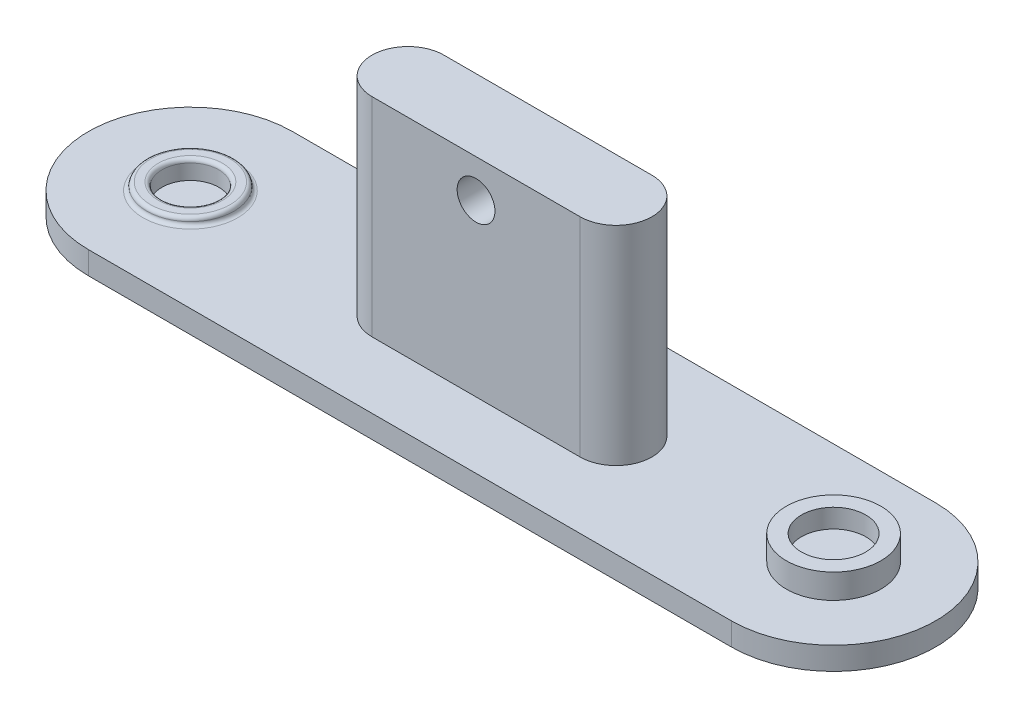
ISO-10303-21;
HEADER;
FILE_DESCRIPTION(('STEP AP214'),'2;1');
FILE_NAME('part.step','',(''),(''),'','','');
FILE_SCHEMA(('AUTOMOTIVE_DESIGN { 1 0 10303 214 1 1 1 1 }'));
ENDSEC;
DATA;
#1=APPLICATION_CONTEXT('core data for automotive mechanical design processes');
#2=APPLICATION_PROTOCOL_DEFINITION('international standard','automotive_design',2000,#1);
#3=PRODUCT_CONTEXT('',#1,'mechanical');
#4=PRODUCT('Part','Part','',(#3));
#5=PRODUCT_RELATED_PRODUCT_CATEGORY('part','',(#4));
#6=PRODUCT_DEFINITION_FORMATION('','',#4);
#7=PRODUCT_DEFINITION_CONTEXT('part definition',#1,'design');
#8=PRODUCT_DEFINITION('design','',#6,#7);
#9=PRODUCT_DEFINITION_SHAPE('','',#8);
#10=(LENGTH_UNIT() NAMED_UNIT(*) SI_UNIT(.MILLI.,.METRE.));
#11=(NAMED_UNIT(*) PLANE_ANGLE_UNIT() SI_UNIT($,.RADIAN.));
#12=(NAMED_UNIT(*) SI_UNIT($,.STERADIAN.) SOLID_ANGLE_UNIT());
#13=UNCERTAINTY_MEASURE_WITH_UNIT(LENGTH_MEASURE(1.E-05),#10,'distance_accuracy_value','');
#14=(GEOMETRIC_REPRESENTATION_CONTEXT(3) GLOBAL_UNCERTAINTY_ASSIGNED_CONTEXT((#13)) GLOBAL_UNIT_ASSIGNED_CONTEXT((#10,
#11,#12)) REPRESENTATION_CONTEXT('',''));
#15=CARTESIAN_POINT('',(0.,0.,0.));
#16=DIRECTION('',(0.,0.,1.));
#17=DIRECTION('',(1.,0.,0.));
#18=AXIS2_PLACEMENT_3D('',#15,#16,#17);
#19=CARTESIAN_POINT('',(-42.5000000000004,3.,0.));
#20=DIRECTION('',(0.,1.,0.));
#21=DIRECTION('',(0.,0.,1.));
#22=AXIS2_PLACEMENT_3D('',#19,#20,#21);
#23=PLANE('',#22);
#24=CARTESIAN_POINT('',(-42.5000000000004,3.,0.));
#25=DIRECTION('',(0.,1.,0.));
#26=DIRECTION('',(0.,0.,1.));
#27=AXIS2_PLACEMENT_3D('',#24,#25,#26);
#28=CIRCLE('',#27,6.25);
#29=CARTESIAN_POINT('',(-42.5000000000004,3.,6.25));
#30=VERTEX_POINT('',#29);
#31=EDGE_CURVE('E11',#30,#30,#28,.F.);
#32=ORIENTED_EDGE('',*,*,#31,.T.);
#33=EDGE_LOOP('',(#32));
#34=FACE_BOUND('',#33,.T.);
#35=CARTESIAN_POINT('',(42.5000000000004,3.,0.));
#36=DIRECTION('',(0.,1.,0.));
#37=DIRECTION('',(0.,0.,1.));
#38=AXIS2_PLACEMENT_3D('',#35,#36,#37);
#39=CIRCLE('',#38,6.25);
#40=CARTESIAN_POINT('',(42.5000000000004,3.,-6.25000000000001));
#41=VERTEX_POINT('',#40);
#42=EDGE_CURVE('E168',#41,#41,#39,.T.);
#43=ORIENTED_EDGE('',*,*,#42,.F.);
#44=EDGE_LOOP('',(#43));
#45=FACE_BOUND('',#44,.T.);
#46=CARTESIAN_POINT('',(-42.5000000000004,3.,0.));
#47=DIRECTION('',(0.,1.,0.));
#48=DIRECTION('',(0.,0.,1.));
#49=AXIS2_PLACEMENT_3D('',#46,#47,#48);
#50=CIRCLE('',#49,13.5);
#51=CARTESIAN_POINT('',(-42.5000000000004,3.,-13.5));
#52=VERTEX_POINT('',#51);
#53=CARTESIAN_POINT('',(-42.5000000000004,3.,13.5));
#54=VERTEX_POINT('',#53);
#55=EDGE_CURVE('E182',#52,#54,#50,.T.);
#56=ORIENTED_EDGE('',*,*,#55,.T.);
#57=DIRECTION('',(1.,0.,0.));
#58=VECTOR('',#57,1.);
#59=CARTESIAN_POINT('',(-42.5000000000004,3.,13.5));
#60=LINE('',#59,#58);
#61=CARTESIAN_POINT('',(42.5000000000005,3.,13.5));
#62=VERTEX_POINT('',#61);
#63=EDGE_CURVE('E104',#54,#62,#60,.T.);
#64=ORIENTED_EDGE('',*,*,#63,.T.);
#65=CARTESIAN_POINT('',(42.5000000000004,3.,0.));
#66=DIRECTION('',(0.,1.,0.));
#67=DIRECTION('',(0.,0.,-1.));
#68=AXIS2_PLACEMENT_3D('',#65,#66,#67);
#69=CIRCLE('',#68,13.5);
#70=CARTESIAN_POINT('',(42.5000000000004,3.,-13.5));
#71=VERTEX_POINT('',#70);
#72=EDGE_CURVE('E187',#62,#71,#69,.T.);
#73=ORIENTED_EDGE('',*,*,#72,.T.);
#74=DIRECTION('',(-1.,0.,0.));
#75=VECTOR('',#74,1.);
#76=CARTESIAN_POINT('',(-42.5000000000004,3.,-13.5));
#77=LINE('',#76,#75);
#78=EDGE_CURVE('E69',#71,#52,#77,.T.);
#79=ORIENTED_EDGE('',*,*,#78,.T.);
#80=EDGE_LOOP('',(#56,#64,#73,#79));
#81=FACE_BOUND('',#80,.T.);
#82=DIRECTION('',(1.,0.,0.));
#83=VECTOR('',#82,1.);
#84=CARTESIAN_POINT('',(-13.75,3.,4.75));
#85=LINE('',#84,#83);
#86=CARTESIAN_POINT('',(-13.75,3.,4.75));
#87=VERTEX_POINT('',#86);
#88=CARTESIAN_POINT('',(13.75,3.,4.75));
#89=VERTEX_POINT('',#88);
#90=EDGE_CURVE('E474',#87,#89,#85,.T.);
#91=ORIENTED_EDGE('',*,*,#90,.F.);
#92=CARTESIAN_POINT('',(-13.75,3.,0.));
#93=DIRECTION('',(0.,1.,0.));
#94=DIRECTION('',(0.,0.,1.));
#95=AXIS2_PLACEMENT_3D('',#92,#93,#94);
#96=CIRCLE('',#95,4.75);
#97=CARTESIAN_POINT('',(-13.75,3.,-4.75));
#98=VERTEX_POINT('',#97);
#99=EDGE_CURVE('E151',#98,#87,#96,.T.);
#100=ORIENTED_EDGE('',*,*,#99,.F.);
#101=DIRECTION('',(-1.,0.,0.));
#102=VECTOR('',#101,1.);
#103=CARTESIAN_POINT('',(-13.75,3.,-4.75));
#104=LINE('',#103,#102);
#105=CARTESIAN_POINT('',(13.75,3.,-4.75));
#106=VERTEX_POINT('',#105);
#107=EDGE_CURVE('E147',#106,#98,#104,.T.);
#108=ORIENTED_EDGE('',*,*,#107,.F.);
#109=CARTESIAN_POINT('',(13.75,3.,0.));
#110=DIRECTION('',(0.,1.,0.));
#111=DIRECTION('',(0.,0.,-1.));
#112=AXIS2_PLACEMENT_3D('',#109,#110,#111);
#113=CIRCLE('',#112,4.75);
#114=EDGE_CURVE('E483',#89,#106,#113,.T.);
#115=ORIENTED_EDGE('',*,*,#114,.F.);
#116=EDGE_LOOP('',(#91,#100,#108,#115));
#117=FACE_BOUND('',#116,.T.);
#118=ADVANCED_FACE('F39',(#34,#45,#81,#117),#23,.T.);
#119=CARTESIAN_POINT('',(-42.5000000000004,3.,0.));
#120=DIRECTION('',(0.,-1.,0.));
#121=DIRECTION('',(0.,0.,-1.));
#122=AXIS2_PLACEMENT_3D('',#119,#120,#121);
#123=CYLINDRICAL_SURFACE('',#122,13.5);
#124=CARTESIAN_POINT('',(-42.5000000000004,0.,0.));
#125=DIRECTION('',(0.,1.,0.));
#126=DIRECTION('',(0.,0.,1.));
#127=AXIS2_PLACEMENT_3D('',#124,#125,#126);
#128=CIRCLE('',#127,13.5);
#129=CARTESIAN_POINT('',(-42.5000000000004,0.,-13.5));
#130=VERTEX_POINT('',#129);
#131=CARTESIAN_POINT('',(-42.5000000000004,0.,13.5));
#132=VERTEX_POINT('',#131);
#133=EDGE_CURVE('E181',#130,#132,#128,.T.);
#134=ORIENTED_EDGE('',*,*,#133,.T.);
#135=DIRECTION('',(0.,-1.,0.));
#136=VECTOR('',#135,1.);
#137=CARTESIAN_POINT('',(-42.5000000000004,3.,13.5));
#138=LINE('',#137,#136);
#139=EDGE_CURVE('E212',#54,#132,#138,.T.);
#140=ORIENTED_EDGE('',*,*,#139,.F.);
#141=ORIENTED_EDGE('',*,*,#55,.F.);
#142=DIRECTION('',(0.,-1.,0.));
#143=VECTOR('',#142,1.);
#144=CARTESIAN_POINT('',(-42.5000000000004,3.,-13.5));
#145=LINE('',#144,#143);
#146=EDGE_CURVE('E192',#52,#130,#145,.T.);
#147=ORIENTED_EDGE('',*,*,#146,.T.);
#148=EDGE_LOOP('',(#134,#140,#141,#147));
#149=FACE_BOUND('',#148,.T.);
#150=ADVANCED_FACE('F254',(#149),#123,.T.);
#151=CARTESIAN_POINT('',(-42.5000000000004,3.,13.5));
#152=DIRECTION('',(0.,0.,-1.));
#153=DIRECTION('',(-1.,0.,0.));
#154=AXIS2_PLACEMENT_3D('',#151,#152,#153);
#155=PLANE('',#154);
#156=DIRECTION('',(1.,0.,0.));
#157=VECTOR('',#156,1.);
#158=CARTESIAN_POINT('',(-42.5000000000004,0.,13.5));
#159=LINE('',#158,#157);
#160=CARTESIAN_POINT('',(42.5000000000005,0.,13.5));
#161=VERTEX_POINT('',#160);
#162=EDGE_CURVE('E196',#132,#161,#159,.T.);
#163=ORIENTED_EDGE('',*,*,#162,.T.);
#164=DIRECTION('',(0.,-1.,0.));
#165=VECTOR('',#164,1.);
#166=CARTESIAN_POINT('',(42.5000000000005,3.,13.5));
#167=LINE('',#166,#165);
#168=EDGE_CURVE('E209',#62,#161,#167,.T.);
#169=ORIENTED_EDGE('',*,*,#168,.F.);
#170=ORIENTED_EDGE('',*,*,#63,.F.);
#171=ORIENTED_EDGE('',*,*,#139,.T.);
#172=EDGE_LOOP('',(#163,#169,#170,#171));
#173=FACE_BOUND('',#172,.T.);
#174=ADVANCED_FACE('F260',(#173),#155,.F.);
#175=CARTESIAN_POINT('',(42.5000000000004,3.,0.));
#176=DIRECTION('',(0.,-1.,0.));
#177=DIRECTION('',(0.,0.,-1.));
#178=AXIS2_PLACEMENT_3D('',#175,#176,#177);
#179=CYLINDRICAL_SURFACE('',#178,13.5);
#180=CARTESIAN_POINT('',(42.5000000000004,0.,0.));
#181=DIRECTION('',(0.,1.,0.));
#182=DIRECTION('',(0.,0.,-1.));
#183=AXIS2_PLACEMENT_3D('',#180,#181,#182);
#184=CIRCLE('',#183,13.5);
#185=CARTESIAN_POINT('',(42.5000000000004,0.,-13.5));
#186=VERTEX_POINT('',#185);
#187=EDGE_CURVE('E199',#161,#186,#184,.T.);
#188=ORIENTED_EDGE('',*,*,#187,.T.);
#189=DIRECTION('',(0.,-1.,0.));
#190=VECTOR('',#189,1.);
#191=CARTESIAN_POINT('',(42.5000000000004,3.,-13.5));
#192=LINE('',#191,#190);
#193=EDGE_CURVE('E206',#71,#186,#192,.T.);
#194=ORIENTED_EDGE('',*,*,#193,.F.);
#195=ORIENTED_EDGE('',*,*,#72,.F.);
#196=ORIENTED_EDGE('',*,*,#168,.T.);
#197=EDGE_LOOP('',(#188,#194,#195,#196));
#198=FACE_BOUND('',#197,.T.);
#199=ADVANCED_FACE('F273',(#198),#179,.T.);
#200=CARTESIAN_POINT('',(-42.5000000000004,3.,-13.5));
#201=DIRECTION('',(0.,0.,1.));
#202=DIRECTION('',(1.,0.,0.));
#203=AXIS2_PLACEMENT_3D('',#200,#201,#202);
#204=PLANE('',#203);
#205=DIRECTION('',(-1.,0.,0.));
#206=VECTOR('',#205,1.);
#207=CARTESIAN_POINT('',(-42.5000000000004,0.,-13.5));
#208=LINE('',#207,#206);
#209=EDGE_CURVE('E96',#186,#130,#208,.T.);
#210=ORIENTED_EDGE('',*,*,#209,.T.);
#211=ORIENTED_EDGE('',*,*,#146,.F.);
#212=ORIENTED_EDGE('',*,*,#78,.F.);
#213=ORIENTED_EDGE('',*,*,#193,.T.);
#214=EDGE_LOOP('',(#210,#211,#212,#213));
#215=FACE_BOUND('',#214,.T.);
#216=ADVANCED_FACE('F269',(#215),#204,.F.);
#217=CARTESIAN_POINT('',(-42.5000000000004,0.,0.));
#218=DIRECTION('',(0.,1.,0.));
#219=DIRECTION('',(0.,0.,1.));
#220=AXIS2_PLACEMENT_3D('',#217,#218,#219);
#221=PLANE('',#220);
#222=ORIENTED_EDGE('',*,*,#133,.F.);
#223=ORIENTED_EDGE('',*,*,#209,.F.);
#224=ORIENTED_EDGE('',*,*,#187,.F.);
#225=ORIENTED_EDGE('',*,*,#162,.F.);
#226=EDGE_LOOP('',(#222,#223,#224,#225));
#227=FACE_BOUND('',#226,.T.);
#228=ADVANCED_FACE('F266',(#227),#221,.F.);
#229=CARTESIAN_POINT('',(-42.5000000000004,4.,0.));
#230=DIRECTION('',(0.,1.,0.));
#231=DIRECTION('',(0.,0.,1.));
#232=AXIS2_PLACEMENT_3D('',#229,#230,#231);
#233=PLANE('',#232);
#234=CARTESIAN_POINT('',(-42.5000000000004,4.,0.));
#235=DIRECTION('',(0.,1.,0.));
#236=DIRECTION('',(0.,0.,1.));
#237=AXIS2_PLACEMENT_3D('',#234,#235,#236);
#238=CIRCLE('',#237,4.25000000000001);
#239=CARTESIAN_POINT('',(-42.5000000000004,4.,4.25000000000001));
#240=VERTEX_POINT('',#239);
#241=EDGE_CURVE('E49',#240,#240,#238,.F.);
#242=ORIENTED_EDGE('',*,*,#241,.T.);
#243=EDGE_LOOP('',(#242));
#244=FACE_BOUND('',#243,.T.);
#245=CARTESIAN_POINT('',(-42.5000000000004,4.,0.));
#246=DIRECTION('',(0.,1.,0.));
#247=DIRECTION('',(0.,0.,1.));
#248=AXIS2_PLACEMENT_3D('',#245,#246,#247);
#249=CIRCLE('',#248,5.25);
#250=CARTESIAN_POINT('',(-42.5000000000004,4.,5.25));
#251=VERTEX_POINT('',#250);
#252=EDGE_CURVE('E219',#251,#251,#249,.T.);
#253=ORIENTED_EDGE('',*,*,#252,.T.);
#254=EDGE_LOOP('',(#253));
#255=FACE_BOUND('',#254,.T.);
#256=ADVANCED_FACE('F227',(#244,#255),#233,.T.);
#257=CARTESIAN_POINT('',(-42.5000000000004,1.5,0.));
#258=DIRECTION('',(0.,1.,0.));
#259=DIRECTION('',(0.,0.,1.));
#260=AXIS2_PLACEMENT_3D('',#257,#258,#259);
#261=CYLINDRICAL_SURFACE('',#260,3.75000000000001);
#262=CARTESIAN_POINT('',(-42.5000000000004,3.5,0.));
#263=DIRECTION('',(0.,1.,0.));
#264=DIRECTION('',(0.,0.,1.));
#265=AXIS2_PLACEMENT_3D('',#262,#263,#264);
#266=CIRCLE('',#265,3.75000000000001);
#267=CARTESIAN_POINT('',(-42.5000000000004,3.5,3.75000000000001));
#268=VERTEX_POINT('',#267);
#269=EDGE_CURVE('E215',#268,#268,#266,.T.);
#270=ORIENTED_EDGE('',*,*,#269,.T.);
#271=EDGE_LOOP('',(#270));
#272=FACE_BOUND('',#271,.T.);
#273=CARTESIAN_POINT('',(-42.5000000000004,1.5,0.));
#274=DIRECTION('',(0.,1.,0.));
#275=DIRECTION('',(0.,0.,1.));
#276=AXIS2_PLACEMENT_3D('',#273,#274,#275);
#277=CIRCLE('',#276,3.75000000000001);
#278=CARTESIAN_POINT('',(-42.5000000000004,1.5,3.75000000000001));
#279=VERTEX_POINT('',#278);
#280=EDGE_CURVE('E174',#279,#279,#277,.T.);
#281=ORIENTED_EDGE('',*,*,#280,.F.);
#282=EDGE_LOOP('',(#281));
#283=FACE_BOUND('',#282,.T.);
#284=ADVANCED_FACE('F237',(#272,#283),#261,.F.);
#285=CARTESIAN_POINT('',(-42.5000000000004,1.5,0.));
#286=DIRECTION('',(0.,1.,0.));
#287=DIRECTION('',(0.,0.,1.));
#288=AXIS2_PLACEMENT_3D('',#285,#286,#287);
#289=PLANE('',#288);
#290=ORIENTED_EDGE('',*,*,#280,.T.);
#291=EDGE_LOOP('',(#290));
#292=FACE_BOUND('',#291,.T.);
#293=ADVANCED_FACE('F240',(#292),#289,.T.);
#294=CARTESIAN_POINT('',(42.5000000000004,6.25,0.));
#295=DIRECTION('',(0.,-1.,0.));
#296=DIRECTION('',(0.,0.,-1.));
#297=AXIS2_PLACEMENT_3D('',#294,#295,#296);
#298=CYLINDRICAL_SURFACE('',#297,6.25);
#299=CARTESIAN_POINT('',(42.5000000000004,6.25,0.));
#300=DIRECTION('',(0.,1.,0.));
#301=DIRECTION('',(0.,0.,1.));
#302=AXIS2_PLACEMENT_3D('',#299,#300,#301);
#303=CIRCLE('',#302,6.25);
#304=CARTESIAN_POINT('',(42.5000000000004,6.25,-6.25000000000001));
#305=VERTEX_POINT('',#304);
#306=EDGE_CURVE('E170',#305,#305,#303,.T.);
#307=CARTESIAN_POINT('',(42.5000000000004,6.25,-6.25000000000001));
#308=CARTESIAN_POINT('',(42.5000000000004,6.21614583333333,-6.25000000000001));
#309=CARTESIAN_POINT('',(42.5000000000004,6.18229166666667,-6.25000000000001));
#310=CARTESIAN_POINT('',(42.5000000000004,6.11458333333333,-6.25000000000001));
#311=CARTESIAN_POINT('',(42.5000000000004,6.08072916666667,-6.25000000000001));
#312=CARTESIAN_POINT('',(42.5000000000004,6.01302083333333,-6.25000000000001));
#313=CARTESIAN_POINT('',(42.5000000000004,5.97916666666667,-6.25000000000001));
#314=CARTESIAN_POINT('',(42.5000000000004,5.91145833333333,-6.25000000000001));
#315=CARTESIAN_POINT('',(42.5000000000004,5.87760416666667,-6.25000000000001));
#316=CARTESIAN_POINT('',(42.5000000000004,5.80989583333333,-6.25000000000001));
#317=CARTESIAN_POINT('',(42.5000000000004,5.77604166666667,-6.25000000000001));
#318=CARTESIAN_POINT('',(42.5000000000004,5.70833333333333,-6.25000000000001));
#319=CARTESIAN_POINT('',(42.5000000000004,5.67447916666667,-6.25000000000001));
#320=CARTESIAN_POINT('',(42.5000000000004,5.60677083333333,-6.25000000000001));
#321=CARTESIAN_POINT('',(42.5000000000004,5.57291666666667,-6.25000000000001));
#322=CARTESIAN_POINT('',(42.5000000000004,5.50520833333333,-6.25000000000001));
#323=CARTESIAN_POINT('',(42.5000000000004,5.47135416666667,-6.25000000000001));
#324=CARTESIAN_POINT('',(42.5000000000004,5.40364583333333,-6.25000000000001));
#325=CARTESIAN_POINT('',(42.5000000000004,5.36979166666667,-6.25000000000001));
#326=CARTESIAN_POINT('',(42.5000000000004,5.30208333333333,-6.25000000000001));
#327=CARTESIAN_POINT('',(42.5000000000004,5.26822916666667,-6.25000000000001));
#328=CARTESIAN_POINT('',(42.5000000000004,5.20052083333333,-6.25000000000001));
#329=CARTESIAN_POINT('',(42.5000000000004,5.16666666666667,-6.25000000000001));
#330=CARTESIAN_POINT('',(42.5000000000004,5.09895833333333,-6.25000000000001));
#331=CARTESIAN_POINT('',(42.5000000000004,5.06510416666667,-6.25000000000001));
#332=CARTESIAN_POINT('',(42.5000000000004,4.99739583333333,-6.25000000000001));
#333=CARTESIAN_POINT('',(42.5000000000004,4.96354166666667,-6.25000000000001));
#334=CARTESIAN_POINT('',(42.5000000000004,4.89583333333333,-6.25000000000001));
#335=CARTESIAN_POINT('',(42.5000000000004,4.86197916666667,-6.25000000000001));
#336=CARTESIAN_POINT('',(42.5000000000004,4.79427083333333,-6.25000000000001));
#337=CARTESIAN_POINT('',(42.5000000000004,4.76041666666667,-6.25000000000001));
#338=CARTESIAN_POINT('',(42.5000000000004,4.69270833333333,-6.25000000000001));
#339=CARTESIAN_POINT('',(42.5000000000004,4.65885416666667,-6.25000000000001));
#340=CARTESIAN_POINT('',(42.5000000000004,4.59114583333333,-6.25000000000001));
#341=CARTESIAN_POINT('',(42.5000000000004,4.55729166666667,-6.25000000000001));
#342=CARTESIAN_POINT('',(42.5000000000004,4.48958333333333,-6.25000000000001));
#343=CARTESIAN_POINT('',(42.5000000000004,4.45572916666667,-6.25000000000001));
#344=CARTESIAN_POINT('',(42.5000000000004,4.38802083333333,-6.25000000000001));
#345=CARTESIAN_POINT('',(42.5000000000004,4.35416666666667,-6.25000000000001));
#346=CARTESIAN_POINT('',(42.5000000000004,4.28645833333333,-6.25000000000001));
#347=CARTESIAN_POINT('',(42.5000000000004,4.25260416666667,-6.25000000000001));
#348=CARTESIAN_POINT('',(42.5000000000004,4.18489583333333,-6.25000000000001));
#349=CARTESIAN_POINT('',(42.5000000000004,4.15104166666667,-6.25000000000001));
#350=CARTESIAN_POINT('',(42.5000000000004,4.08333333333333,-6.25000000000001));
#351=CARTESIAN_POINT('',(42.5000000000004,4.04947916666667,-6.25000000000001));
#352=CARTESIAN_POINT('',(42.5000000000004,3.98177083333333,-6.25000000000001));
#353=CARTESIAN_POINT('',(42.5000000000004,3.94791666666667,-6.25000000000001));
#354=CARTESIAN_POINT('',(42.5000000000004,3.88020833333333,-6.25000000000001));
#355=CARTESIAN_POINT('',(42.5000000000004,3.84635416666667,-6.25000000000001));
#356=CARTESIAN_POINT('',(42.5000000000004,3.77864583333333,-6.25000000000001));
#357=CARTESIAN_POINT('',(42.5000000000004,3.74479166666667,-6.25000000000001));
#358=CARTESIAN_POINT('',(42.5000000000004,3.67708333333333,-6.25000000000001));
#359=CARTESIAN_POINT('',(42.5000000000004,3.64322916666667,-6.25000000000001));
#360=CARTESIAN_POINT('',(42.5000000000004,3.57552083333333,-6.25000000000001));
#361=CARTESIAN_POINT('',(42.5000000000004,3.54166666666667,-6.25000000000001));
#362=CARTESIAN_POINT('',(42.5000000000004,3.47395833333333,-6.25000000000001));
#363=CARTESIAN_POINT('',(42.5000000000004,3.44010416666667,-6.25000000000001));
#364=CARTESIAN_POINT('',(42.5000000000004,3.37239583333333,-6.25000000000001));
#365=CARTESIAN_POINT('',(42.5000000000004,3.33854166666667,-6.25000000000001));
#366=CARTESIAN_POINT('',(42.5000000000004,3.27083333333333,-6.25000000000001));
#367=CARTESIAN_POINT('',(42.5000000000004,3.23697916666667,-6.25000000000001));
#368=CARTESIAN_POINT('',(42.5000000000004,3.16927083333333,-6.25000000000001));
#369=CARTESIAN_POINT('',(42.5000000000004,3.13541666666667,-6.25000000000001));
#370=CARTESIAN_POINT('',(42.5000000000004,3.06770833333333,-6.25000000000001));
#371=CARTESIAN_POINT('',(42.5000000000004,3.03385416666667,-6.25000000000001));
#372=CARTESIAN_POINT('',(42.5000000000004,3.,-6.25000000000001));
#373=B_SPLINE_CURVE_WITH_KNOTS('',3,(#307,#308,#309,#310,#311,#312,#313,#314,#315,#316,#317,
#318,#319,#320,#321,#322,#323,#324,#325,#326,#327,#328,#329,#330,#331,#332,#333,#334,#335,#336,
#337,#338,#339,#340,#341,#342,#343,#344,#345,#346,#347,#348,#349,#350,#351,#352,#353,#354,#355,
#356,#357,#358,#359,#360,#361,#362,#363,#364,#365,#366,#367,#368,#369,#370,#371,#372),
.UNSPECIFIED.,.F.,.F.,(4,2,2,2,2,2,2,2,2,2,2,2,2,2,2,2,2,2,2,2,2,2,2,2,2,2,2,2,2,2,2,2,4),(0.,
0.101562499999999,0.203124999999999,0.304687499999999,0.40625,0.5078125,0.609375,0.7109375,
0.8125,0.9140625,1.015625,1.1171875,1.21875,1.3203125,1.421875,1.5234375,1.625,1.7265625,
1.828125,1.9296875,2.03125,2.1328125,2.234375,2.3359375,2.4375,2.5390625,2.640625,2.7421875,
2.84375,2.9453125,3.046875,3.1484375,3.25),.UNSPECIFIED.);
#374=EDGE_CURVE('BSEAM245',#305,#41,#373,.T.);
#375=ORIENTED_EDGE('',*,*,#306,.F.);
#376=ORIENTED_EDGE('',*,*,#42,.T.);
#377=ORIENTED_EDGE('',*,*,#374,.T.);
#378=ORIENTED_EDGE('',*,*,#374,.F.);
#379=EDGE_LOOP('',(#375,#377,#376,#378));
#380=FACE_BOUND('',#379,.T.);
#381=ADVANCED_FACE('F245',(#380),#298,.T.);
#382=CARTESIAN_POINT('',(42.5000000000004,6.25,0.));
#383=DIRECTION('',(0.,1.,0.));
#384=DIRECTION('',(0.,0.,1.));
#385=AXIS2_PLACEMENT_3D('',#382,#383,#384);
#386=PLANE('',#385);
#387=CARTESIAN_POINT('',(42.5000000000004,6.25,0.));
#388=DIRECTION('',(0.,1.,0.));
#389=DIRECTION('',(0.,0.,1.));
#390=AXIS2_PLACEMENT_3D('',#387,#388,#389);
#391=CIRCLE('',#390,4.25000000000001);
#392=CARTESIAN_POINT('',(42.5000000000004,6.25,4.24999999999999));
#393=VERTEX_POINT('',#392);
#394=EDGE_CURVE('E154',#393,#393,#391,.T.);
#395=ORIENTED_EDGE('',*,*,#394,.F.);
#396=EDGE_LOOP('',(#395));
#397=FACE_BOUND('',#396,.T.);
#398=ORIENTED_EDGE('',*,*,#306,.T.);
#399=EDGE_LOOP('',(#398));
#400=FACE_BOUND('',#399,.T.);
#401=ADVANCED_FACE('F250',(#397,#400),#386,.T.);
#402=CARTESIAN_POINT('',(42.5000000000004,3.75,0.));
#403=DIRECTION('',(0.,1.,0.));
#404=DIRECTION('',(0.,0.,1.));
#405=AXIS2_PLACEMENT_3D('',#402,#403,#404);
#406=CYLINDRICAL_SURFACE('',#405,4.25000000000001);
#407=CARTESIAN_POINT('',(42.5000000000004,3.75,0.));
#408=DIRECTION('',(0.,1.,0.));
#409=DIRECTION('',(0.,0.,1.));
#410=AXIS2_PLACEMENT_3D('',#407,#408,#409);
#411=CIRCLE('',#410,4.25000000000001);
#412=CARTESIAN_POINT('',(42.5000000000004,3.75,4.24999999999999));
#413=VERTEX_POINT('',#412);
#414=EDGE_CURVE('E160',#413,#413,#411,.T.);
#415=ORIENTED_EDGE('',*,*,#414,.F.);
#416=EDGE_LOOP('',(#415));
#417=FACE_BOUND('',#416,.T.);
#418=ORIENTED_EDGE('',*,*,#394,.T.);
#419=EDGE_LOOP('',(#418));
#420=FACE_BOUND('',#419,.T.);
#421=ADVANCED_FACE('F354',(#417,#420),#406,.F.);
#422=CARTESIAN_POINT('',(42.5000000000004,3.75,0.));
#423=DIRECTION('',(0.,1.,0.));
#424=DIRECTION('',(0.,0.,1.));
#425=AXIS2_PLACEMENT_3D('',#422,#423,#424);
#426=PLANE('',#425);
#427=ORIENTED_EDGE('',*,*,#414,.T.);
#428=EDGE_LOOP('',(#427));
#429=FACE_BOUND('',#428,.T.);
#430=ADVANCED_FACE('F358',(#429),#426,.T.);
#431=CARTESIAN_POINT('',(-13.75,30.5,0.));
#432=DIRECTION('',(0.,-1.,0.));
#433=DIRECTION('',(0.,0.,-1.));
#434=AXIS2_PLACEMENT_3D('',#431,#432,#433);
#435=CYLINDRICAL_SURFACE('',#434,4.75);
#436=ORIENTED_EDGE('',*,*,#99,.T.);
#437=DIRECTION('',(0.,-1.,0.));
#438=VECTOR('',#437,1.);
#439=CARTESIAN_POINT('',(-13.75,30.5,4.75));
#440=LINE('',#439,#438);
#441=CARTESIAN_POINT('',(-13.75,30.5,4.75));
#442=VERTEX_POINT('',#441);
#443=EDGE_CURVE('E132',#442,#87,#440,.T.);
#444=ORIENTED_EDGE('',*,*,#443,.F.);
#445=CARTESIAN_POINT('',(-13.75,30.5,0.));
#446=DIRECTION('',(0.,1.,0.));
#447=DIRECTION('',(0.,0.,1.));
#448=AXIS2_PLACEMENT_3D('',#445,#446,#447);
#449=CIRCLE('',#448,4.75);
#450=CARTESIAN_POINT('',(-13.75,30.5,-4.75));
#451=VERTEX_POINT('',#450);
#452=EDGE_CURVE('E139',#451,#442,#449,.T.);
#453=ORIENTED_EDGE('',*,*,#452,.F.);
#454=DIRECTION('',(0.,-1.,0.));
#455=VECTOR('',#454,1.);
#456=CARTESIAN_POINT('',(-13.75,30.5,-4.75));
#457=LINE('',#456,#455);
#458=EDGE_CURVE('E479',#451,#98,#457,.T.);
#459=ORIENTED_EDGE('',*,*,#458,.T.);
#460=EDGE_LOOP('',(#436,#444,#453,#459));
#461=FACE_BOUND('',#460,.T.);
#462=ADVANCED_FACE('F149',(#461),#435,.T.);
#463=CARTESIAN_POINT('',(-13.75,30.5,4.75));
#464=DIRECTION('',(0.,0.,-1.));
#465=DIRECTION('',(-1.,0.,0.));
#466=AXIS2_PLACEMENT_3D('',#463,#464,#465);
#467=PLANE('',#466);
#468=CARTESIAN_POINT('',(0.,25.5,4.75));
#469=DIRECTION('',(0.,0.,-1.));
#470=DIRECTION('',(-1.,0.,0.));
#471=AXIS2_PLACEMENT_3D('',#468,#469,#470);
#472=CIRCLE('',#471,2.5);
#473=CARTESIAN_POINT('',(-2.5,25.5,4.75));
#474=VERTEX_POINT('',#473);
#475=EDGE_CURVE('E471',#474,#474,#472,.T.);
#476=ORIENTED_EDGE('',*,*,#475,.T.);
#477=EDGE_LOOP('',(#476));
#478=FACE_BOUND('',#477,.T.);
#479=ORIENTED_EDGE('',*,*,#90,.T.);
#480=DIRECTION('',(0.,-1.,0.));
#481=VECTOR('',#480,1.);
#482=CARTESIAN_POINT('',(13.75,30.5,4.75));
#483=LINE('',#482,#481);
#484=CARTESIAN_POINT('',(13.75,30.5,4.75));
#485=VERTEX_POINT('',#484);
#486=EDGE_CURVE('E135',#485,#89,#483,.T.);
#487=ORIENTED_EDGE('',*,*,#486,.F.);
#488=DIRECTION('',(1.,0.,0.));
#489=VECTOR('',#488,1.);
#490=CARTESIAN_POINT('',(-13.75,30.5,4.75));
#491=LINE('',#490,#489);
#492=EDGE_CURVE('E128',#442,#485,#491,.T.);
#493=ORIENTED_EDGE('',*,*,#492,.F.);
#494=ORIENTED_EDGE('',*,*,#443,.T.);
#495=EDGE_LOOP('',(#479,#487,#493,#494));
#496=FACE_BOUND('',#495,.T.);
#497=ADVANCED_FACE('F130',(#478,#496),#467,.F.);
#498=CARTESIAN_POINT('',(13.75,30.5,0.));
#499=DIRECTION('',(0.,-1.,0.));
#500=DIRECTION('',(0.,0.,-1.));
#501=AXIS2_PLACEMENT_3D('',#498,#499,#500);
#502=CYLINDRICAL_SURFACE('',#501,4.75);
#503=ORIENTED_EDGE('',*,*,#114,.T.);
#504=DIRECTION('',(0.,-1.,0.));
#505=VECTOR('',#504,1.);
#506=CARTESIAN_POINT('',(13.75,30.5,-4.75));
#507=LINE('',#506,#505);
#508=CARTESIAN_POINT('',(13.75,30.5,-4.75));
#509=VERTEX_POINT('',#508);
#510=EDGE_CURVE('E58',#509,#106,#507,.T.);
#511=ORIENTED_EDGE('',*,*,#510,.F.);
#512=CARTESIAN_POINT('',(13.75,30.5,0.));
#513=DIRECTION('',(0.,1.,0.));
#514=DIRECTION('',(0.,0.,-1.));
#515=AXIS2_PLACEMENT_3D('',#512,#513,#514);
#516=CIRCLE('',#515,4.75);
#517=EDGE_CURVE('E138',#485,#509,#516,.T.);
#518=ORIENTED_EDGE('',*,*,#517,.F.);
#519=ORIENTED_EDGE('',*,*,#486,.T.);
#520=EDGE_LOOP('',(#503,#511,#518,#519));
#521=FACE_BOUND('',#520,.T.);
#522=ADVANCED_FACE('F325',(#521),#502,.T.);
#523=CARTESIAN_POINT('',(-13.75,30.5,-4.75));
#524=DIRECTION('',(0.,0.,1.));
#525=DIRECTION('',(1.,0.,0.));
#526=AXIS2_PLACEMENT_3D('',#523,#524,#525);
#527=PLANE('',#526);
#528=CARTESIAN_POINT('',(0.,25.5,-4.75));
#529=DIRECTION('',(0.,0.,-1.));
#530=DIRECTION('',(-1.,0.,0.));
#531=AXIS2_PLACEMENT_3D('',#528,#529,#530);
#532=CIRCLE('',#531,2.5);
#533=CARTESIAN_POINT('',(-2.5,25.5,-4.75));
#534=VERTEX_POINT('',#533);
#535=EDGE_CURVE('E468',#534,#534,#532,.T.);
#536=ORIENTED_EDGE('',*,*,#535,.F.);
#537=EDGE_LOOP('',(#536));
#538=FACE_BOUND('',#537,.T.);
#539=ORIENTED_EDGE('',*,*,#107,.T.);
#540=ORIENTED_EDGE('',*,*,#458,.F.);
#541=DIRECTION('',(-1.,0.,0.));
#542=VECTOR('',#541,1.);
#543=CARTESIAN_POINT('',(-13.75,30.5,-4.75));
#544=LINE('',#543,#542);
#545=EDGE_CURVE('E143',#509,#451,#544,.T.);
#546=ORIENTED_EDGE('',*,*,#545,.F.);
#547=ORIENTED_EDGE('',*,*,#510,.T.);
#548=EDGE_LOOP('',(#539,#540,#546,#547));
#549=FACE_BOUND('',#548,.T.);
#550=ADVANCED_FACE('F329',(#538,#549),#527,.F.);
#551=CARTESIAN_POINT('',(-13.75,30.5,0.));
#552=DIRECTION('',(0.,1.,0.));
#553=DIRECTION('',(0.,0.,1.));
#554=AXIS2_PLACEMENT_3D('',#551,#552,#553);
#555=PLANE('',#554);
#556=ORIENTED_EDGE('',*,*,#452,.T.);
#557=ORIENTED_EDGE('',*,*,#492,.T.);
#558=ORIENTED_EDGE('',*,*,#517,.T.);
#559=ORIENTED_EDGE('',*,*,#545,.T.);
#560=EDGE_LOOP('',(#556,#557,#558,#559));
#561=FACE_BOUND('',#560,.T.);
#562=ADVANCED_FACE('F142',(#561),#555,.T.);
#563=CARTESIAN_POINT('',(0.,25.5,13.5));
#564=DIRECTION('',(0.,0.,-1.));
#565=DIRECTION('',(-1.,0.,0.));
#566=AXIS2_PLACEMENT_3D('',#563,#564,#565);
#567=CYLINDRICAL_SURFACE('',#566,2.5);
#568=ORIENTED_EDGE('',*,*,#535,.T.);
#569=EDGE_LOOP('',(#568));
#570=FACE_BOUND('',#569,.T.);
#571=ORIENTED_EDGE('',*,*,#475,.F.);
#572=EDGE_LOOP('',(#571));
#573=FACE_BOUND('',#572,.T.);
#574=ADVANCED_FACE('F233',(#570,#573),#567,.F.);
#575=CARTESIAN_POINT('',(-42.5000000000004,3.5,0.));
#576=DIRECTION('',(0.,1.,0.));
#577=DIRECTION('',(0.,0.,1.));
#578=AXIS2_PLACEMENT_3D('',#575,#576,#577);
#579=TOROIDAL_SURFACE('',#578,4.25000000000001,0.5);
#580=ORIENTED_EDGE('',*,*,#241,.F.);
#581=EDGE_LOOP('',(#580));
#582=FACE_BOUND('',#581,.T.);
#583=ORIENTED_EDGE('',*,*,#269,.F.);
#584=EDGE_LOOP('',(#583));
#585=FACE_BOUND('',#584,.T.);
#586=ADVANCED_FACE('F230',(#582,#585),#579,.T.);
#587=CARTESIAN_POINT('',(-42.5000000000004,3.5,0.));
#588=DIRECTION('',(0.,1.,0.));
#589=DIRECTION('',(0.,0.,1.));
#590=AXIS2_PLACEMENT_3D('',#587,#588,#589);
#591=TOROIDAL_SURFACE('',#590,6.25,0.5);
#592=ORIENTED_EDGE('',*,*,#31,.F.);
#593=EDGE_LOOP('',(#592));
#594=FACE_BOUND('',#593,.T.);
#595=CARTESIAN_POINT('',(-42.5000000000004,3.5,0.));
#596=DIRECTION('',(0.,1.,0.));
#597=DIRECTION('',(0.,0.,1.));
#598=AXIS2_PLACEMENT_3D('',#595,#596,#597);
#599=CIRCLE('',#598,5.75);
#600=CARTESIAN_POINT('',(-42.5000000000004,3.5,5.75));
#601=VERTEX_POINT('',#600);
#602=EDGE_CURVE('E43',#601,#601,#599,.T.);
#603=ORIENTED_EDGE('',*,*,#602,.F.);
#604=EDGE_LOOP('',(#603));
#605=FACE_BOUND('',#604,.T.);
#606=ADVANCED_FACE('F41',(#594,#605),#591,.F.);
#607=CARTESIAN_POINT('',(-42.5000000000004,3.5,0.));
#608=DIRECTION('',(0.,1.,0.));
#609=DIRECTION('',(0.,0.,1.));
#610=AXIS2_PLACEMENT_3D('',#607,#608,#609);
#611=TOROIDAL_SURFACE('',#610,5.25,0.5);
#612=ORIENTED_EDGE('',*,*,#602,.T.);
#613=EDGE_LOOP('',(#612));
#614=FACE_BOUND('',#613,.T.);
#615=ORIENTED_EDGE('',*,*,#252,.F.);
#616=EDGE_LOOP('',(#615));
#617=FACE_BOUND('',#616,.T.);
#618=ADVANCED_FACE('F278',(#614,#617),#611,.T.);
#619=CLOSED_SHELL('',(#118,#150,#174,#199,#216,#228,#256,#284,#293,#381,#401,#421,#430,#462,
#497,#522,#550,#562,#574,#586,#606,#618));
#620=MANIFOLD_SOLID_BREP('B2',#619);
#621=ADVANCED_BREP_SHAPE_REPRESENTATION('',(#18,#620),#14);
#622=SHAPE_DEFINITION_REPRESENTATION(#9,#621);
ENDSEC;
END-ISO-10303-21;
